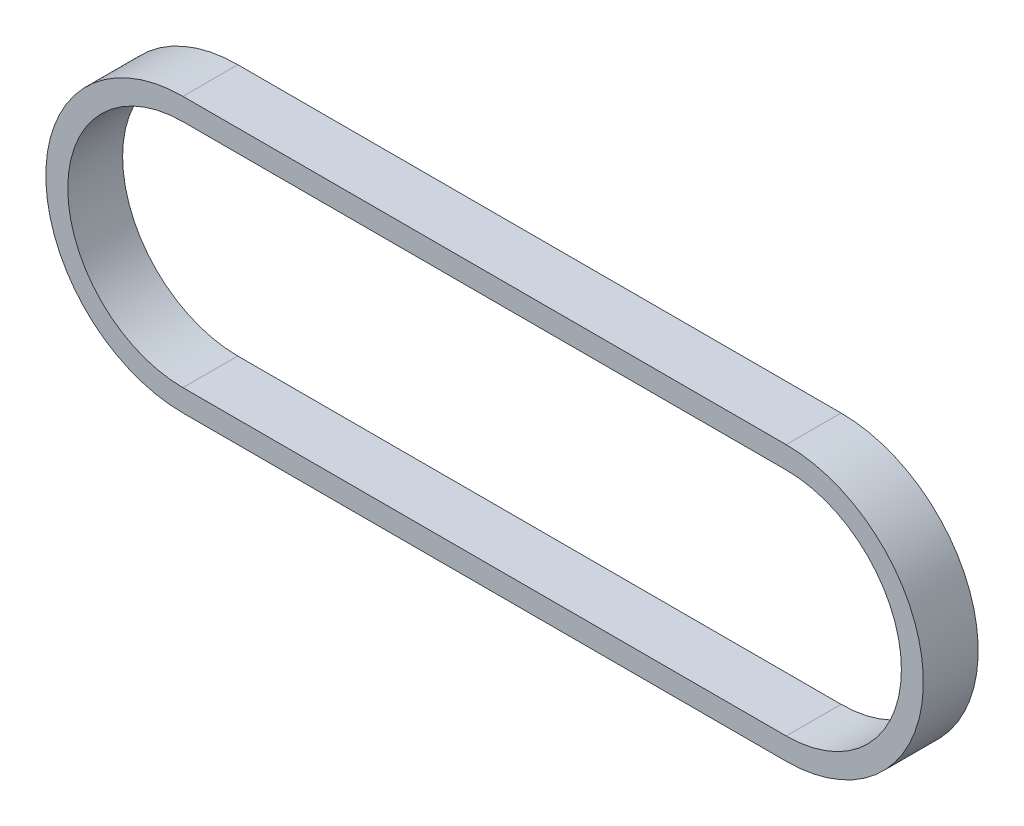
ISO-10303-21;
HEADER;
FILE_DESCRIPTION(('STEP AP214'),'2;1');
FILE_NAME('part.step','',(''),(''),'','','');
FILE_SCHEMA(('AUTOMOTIVE_DESIGN { 1 0 10303 214 1 1 1 1 }'));
ENDSEC;
DATA;
#1=APPLICATION_CONTEXT('core data for automotive mechanical design processes');
#2=APPLICATION_PROTOCOL_DEFINITION('international standard','automotive_design',2000,#1);
#3=PRODUCT_CONTEXT('',#1,'mechanical');
#4=PRODUCT('Part','Part','',(#3));
#5=PRODUCT_RELATED_PRODUCT_CATEGORY('part','',(#4));
#6=PRODUCT_DEFINITION_FORMATION('','',#4);
#7=PRODUCT_DEFINITION_CONTEXT('part definition',#1,'design');
#8=PRODUCT_DEFINITION('design','',#6,#7);
#9=PRODUCT_DEFINITION_SHAPE('','',#8);
#10=(LENGTH_UNIT() NAMED_UNIT(*) SI_UNIT(.MILLI.,.METRE.));
#11=(NAMED_UNIT(*) PLANE_ANGLE_UNIT() SI_UNIT($,.RADIAN.));
#12=(NAMED_UNIT(*) SI_UNIT($,.STERADIAN.) SOLID_ANGLE_UNIT());
#13=UNCERTAINTY_MEASURE_WITH_UNIT(LENGTH_MEASURE(1.E-05),#10,'distance_accuracy_value','');
#14=(GEOMETRIC_REPRESENTATION_CONTEXT(3) GLOBAL_UNCERTAINTY_ASSIGNED_CONTEXT((#13)) GLOBAL_UNIT_ASSIGNED_CONTEXT((#10,
#11,#12)) REPRESENTATION_CONTEXT('',''));
#15=CARTESIAN_POINT('',(0.,0.,0.));
#16=DIRECTION('',(0.,0.,1.));
#17=DIRECTION('',(1.,0.,0.));
#18=AXIS2_PLACEMENT_3D('',#15,#16,#17);
#19=CARTESIAN_POINT('',(0.,-3.05311331771918E-12,10.));
#20=DIRECTION('',(0.,0.,1.));
#21=DIRECTION('',(1.,0.,0.));
#22=AXIS2_PLACEMENT_3D('',#19,#20,#21);
#23=PLANE('',#22);
#24=CARTESIAN_POINT('',(0.,-3.05311331771918E-12,10.));
#25=DIRECTION('',(0.,0.,1.));
#26=DIRECTION('',(1.,0.,0.));
#27=AXIS2_PLACEMENT_3D('',#24,#25,#26);
#28=CIRCLE('',#27,25.);
#29=CARTESIAN_POINT('',(5.82796576721584E-13,-25.0000000000031,10.));
#30=VERTEX_POINT('',#29);
#31=CARTESIAN_POINT('',(-5.83112017288037E-13,24.9999999999969,10.));
#32=VERTEX_POINT('',#31);
#33=EDGE_CURVE('E138',#30,#32,#28,.T.);
#34=ORIENTED_EDGE('',*,*,#33,.T.);
#35=DIRECTION('',(-1.,0.,0.));
#36=VECTOR('',#35,1.);
#37=CARTESIAN_POINT('',(-109.999999999998,24.9999999999969,10.));
#38=LINE('',#37,#36);
#39=CARTESIAN_POINT('',(-109.999999999998,24.999999999997,10.));
#40=VERTEX_POINT('',#39);
#41=EDGE_CURVE('E141',#32,#40,#38,.T.);
#42=ORIENTED_EDGE('',*,*,#41,.T.);
#43=CARTESIAN_POINT('',(-109.999999999997,-3.05311331771918E-12,10.));
#44=DIRECTION('',(0.,0.,1.));
#45=DIRECTION('',(1.,0.,0.));
#46=AXIS2_PLACEMENT_3D('',#43,#44,#45);
#47=CIRCLE('',#46,25.);
#48=CARTESIAN_POINT('',(-109.999999999996,-25.0000000000031,10.));
#49=VERTEX_POINT('',#48);
#50=EDGE_CURVE('E144',#40,#49,#47,.T.);
#51=ORIENTED_EDGE('',*,*,#50,.T.);
#52=DIRECTION('',(1.,0.,0.));
#53=VECTOR('',#52,1.);
#54=CARTESIAN_POINT('',(5.82796576721584E-13,-25.0000000000031,10.));
#55=LINE('',#54,#53);
#56=EDGE_CURVE('E146',#49,#30,#55,.T.);
#57=ORIENTED_EDGE('',*,*,#56,.T.);
#58=EDGE_LOOP('',(#34,#42,#51,#57));
#59=FACE_BOUND('',#58,.T.);
#60=DIRECTION('',(-1.,0.,0.));
#61=VECTOR('',#60,1.);
#62=CARTESIAN_POINT('',(-109.999999999997,20.9999999999971,10.));
#63=LINE('',#62,#61);
#64=CARTESIAN_POINT('',(-1.20967921193697E-13,20.9999999999971,10.));
#65=VERTEX_POINT('',#64);
#66=CARTESIAN_POINT('',(-109.999999999997,20.9999999999971,10.));
#67=VERTEX_POINT('',#66);
#68=EDGE_CURVE('E110',#65,#67,#63,.T.);
#69=ORIENTED_EDGE('',*,*,#68,.F.);
#70=CARTESIAN_POINT('',(3.88578058618805E-13,-2.94209101525666E-12,10.));
#71=DIRECTION('',(0.,0.,1.));
#72=DIRECTION('',(1.,0.,0.));
#73=AXIS2_PLACEMENT_3D('',#70,#71,#72);
#74=CIRCLE('',#73,21.);
#75=CARTESIAN_POINT('',(8.9603286000609E-13,-21.0000000000029,10.));
#76=VERTEX_POINT('',#75);
#77=EDGE_CURVE('E102',#76,#65,#74,.T.);
#78=ORIENTED_EDGE('',*,*,#77,.F.);
#79=DIRECTION('',(1.,0.,0.));
#80=VECTOR('',#79,1.);
#81=CARTESIAN_POINT('',(8.9603286000609E-13,-21.0000000000029,10.));
#82=LINE('',#81,#80);
#83=CARTESIAN_POINT('',(-109.999999999996,-21.0000000000029,10.));
#84=VERTEX_POINT('',#83);
#85=EDGE_CURVE('E124',#84,#76,#82,.T.);
#86=ORIENTED_EDGE('',*,*,#85,.F.);
#87=CARTESIAN_POINT('',(-109.999999999997,-2.94209101525666E-12,10.));
#88=DIRECTION('',(0.,0.,1.));
#89=DIRECTION('',(1.,0.,0.));
#90=AXIS2_PLACEMENT_3D('',#87,#88,#89);
#91=CIRCLE('',#90,21.);
#92=EDGE_CURVE('E122',#67,#84,#91,.T.);
#93=ORIENTED_EDGE('',*,*,#92,.F.);
#94=EDGE_LOOP('',(#69,#78,#86,#93));
#95=FACE_BOUND('',#94,.T.);
#96=ADVANCED_FACE('F37',(#59,#95),#23,.T.);
#97=CARTESIAN_POINT('',(0.,-3.05311331771918E-12,0.));
#98=DIRECTION('',(0.,0.,1.));
#99=DIRECTION('',(1.,0.,0.));
#100=AXIS2_PLACEMENT_3D('',#97,#98,#99);
#101=PLANE('',#100);
#102=CARTESIAN_POINT('',(0.,-3.05311331771918E-12,0.));
#103=DIRECTION('',(0.,0.,1.));
#104=DIRECTION('',(1.,0.,0.));
#105=AXIS2_PLACEMENT_3D('',#102,#103,#104);
#106=CIRCLE('',#105,25.);
#107=CARTESIAN_POINT('',(5.82796576721584E-13,-25.0000000000031,0.));
#108=VERTEX_POINT('',#107);
#109=CARTESIAN_POINT('',(-5.83112017288037E-13,24.9999999999969,0.));
#110=VERTEX_POINT('',#109);
#111=EDGE_CURVE('E118',#108,#110,#106,.T.);
#112=ORIENTED_EDGE('',*,*,#111,.F.);
#113=DIRECTION('',(1.,0.,0.));
#114=VECTOR('',#113,1.);
#115=CARTESIAN_POINT('',(5.82796576721584E-13,-25.0000000000031,0.));
#116=LINE('',#115,#114);
#117=CARTESIAN_POINT('',(-109.999999999996,-25.0000000000031,0.));
#118=VERTEX_POINT('',#117);
#119=EDGE_CURVE('E142',#118,#108,#116,.T.);
#120=ORIENTED_EDGE('',*,*,#119,.F.);
#121=CARTESIAN_POINT('',(-109.999999999997,-3.05311331771918E-12,0.));
#122=DIRECTION('',(0.,0.,1.));
#123=DIRECTION('',(1.,0.,0.));
#124=AXIS2_PLACEMENT_3D('',#121,#122,#123);
#125=CIRCLE('',#124,25.);
#126=CARTESIAN_POINT('',(-109.999999999998,24.999999999997,0.));
#127=VERTEX_POINT('',#126);
#128=EDGE_CURVE('E153',#127,#118,#125,.T.);
#129=ORIENTED_EDGE('',*,*,#128,.F.);
#130=DIRECTION('',(-1.,0.,0.));
#131=VECTOR('',#130,1.);
#132=CARTESIAN_POINT('',(-109.999999999998,24.9999999999969,0.));
#133=LINE('',#132,#131);
#134=EDGE_CURVE('E151',#110,#127,#133,.T.);
#135=ORIENTED_EDGE('',*,*,#134,.F.);
#136=EDGE_LOOP('',(#112,#120,#129,#135));
#137=FACE_BOUND('',#136,.T.);
#138=CARTESIAN_POINT('',(3.88578058618805E-13,-2.94209101525666E-12,0.));
#139=DIRECTION('',(0.,0.,1.));
#140=DIRECTION('',(1.,0.,0.));
#141=AXIS2_PLACEMENT_3D('',#138,#139,#140);
#142=CIRCLE('',#141,21.);
#143=CARTESIAN_POINT('',(8.96032856958341E-13,-21.0000000000029,0.));
#144=VERTEX_POINT('',#143);
#145=CARTESIAN_POINT('',(-1.20967921193697E-13,20.9999999999971,0.));
#146=VERTEX_POINT('',#145);
#147=EDGE_CURVE('E60',#144,#146,#142,.T.);
#148=ORIENTED_EDGE('',*,*,#147,.T.);
#149=DIRECTION('',(-1.,0.,0.));
#150=VECTOR('',#149,1.);
#151=CARTESIAN_POINT('',(-109.999999999997,20.9999999999971,0.));
#152=LINE('',#151,#150);
#153=CARTESIAN_POINT('',(-109.999999999997,20.9999999999971,0.));
#154=VERTEX_POINT('',#153);
#155=EDGE_CURVE('E117',#146,#154,#152,.T.);
#156=ORIENTED_EDGE('',*,*,#155,.T.);
#157=CARTESIAN_POINT('',(-109.999999999997,-2.94209101525666E-12,0.));
#158=DIRECTION('',(0.,0.,1.));
#159=DIRECTION('',(1.,0.,0.));
#160=AXIS2_PLACEMENT_3D('',#157,#158,#159);
#161=CIRCLE('',#160,21.);
#162=CARTESIAN_POINT('',(-109.999999999996,-21.0000000000029,0.));
#163=VERTEX_POINT('',#162);
#164=EDGE_CURVE('E130',#154,#163,#161,.T.);
#165=ORIENTED_EDGE('',*,*,#164,.T.);
#166=DIRECTION('',(1.,0.,0.));
#167=VECTOR('',#166,1.);
#168=CARTESIAN_POINT('',(8.9603286000609E-13,-21.0000000000029,0.));
#169=LINE('',#168,#167);
#170=EDGE_CURVE('E111',#163,#144,#169,.T.);
#171=ORIENTED_EDGE('',*,*,#170,.T.);
#172=EDGE_LOOP('',(#148,#156,#165,#171));
#173=FACE_BOUND('',#172,.T.);
#174=ADVANCED_FACE('F171',(#137,#173),#101,.F.);
#175=CARTESIAN_POINT('',(0.,-3.05311331771918E-12,10.));
#176=DIRECTION('',(0.,0.,-1.));
#177=DIRECTION('',(-1.,0.,0.));
#178=AXIS2_PLACEMENT_3D('',#175,#176,#177);
#179=CYLINDRICAL_SURFACE('',#178,25.);
#180=ORIENTED_EDGE('',*,*,#111,.T.);
#181=DIRECTION('',(0.,0.,-1.));
#182=VECTOR('',#181,1.);
#183=CARTESIAN_POINT('',(-5.83112017288037E-13,24.9999999999969,10.));
#184=LINE('',#183,#182);
#185=EDGE_CURVE('E11',#32,#110,#184,.T.);
#186=ORIENTED_EDGE('',*,*,#185,.F.);
#187=ORIENTED_EDGE('',*,*,#33,.F.);
#188=DIRECTION('',(0.,0.,-1.));
#189=VECTOR('',#188,1.);
#190=CARTESIAN_POINT('',(5.82796576721584E-13,-25.0000000000031,10.));
#191=LINE('',#190,#189);
#192=EDGE_CURVE('E148',#30,#108,#191,.T.);
#193=ORIENTED_EDGE('',*,*,#192,.T.);
#194=EDGE_LOOP('',(#180,#186,#187,#193));
#195=FACE_BOUND('',#194,.T.);
#196=ADVANCED_FACE('F39',(#195),#179,.T.);
#197=CARTESIAN_POINT('',(-109.999999999998,24.9999999999969,10.));
#198=DIRECTION('',(0.,-1.,0.));
#199=DIRECTION('',(0.,0.,-1.));
#200=AXIS2_PLACEMENT_3D('',#197,#198,#199);
#201=PLANE('',#200);
#202=ORIENTED_EDGE('',*,*,#134,.T.);
#203=DIRECTION('',(0.,0.,-1.));
#204=VECTOR('',#203,1.);
#205=CARTESIAN_POINT('',(-109.999999999998,24.999999999997,10.));
#206=LINE('',#205,#204);
#207=EDGE_CURVE('E45',#40,#127,#206,.T.);
#208=ORIENTED_EDGE('',*,*,#207,.F.);
#209=ORIENTED_EDGE('',*,*,#41,.F.);
#210=ORIENTED_EDGE('',*,*,#185,.T.);
#211=EDGE_LOOP('',(#202,#208,#209,#210));
#212=FACE_BOUND('',#211,.T.);
#213=ADVANCED_FACE('F181',(#212),#201,.F.);
#214=CARTESIAN_POINT('',(-109.999999999997,-3.05311331771918E-12,10.));
#215=DIRECTION('',(0.,0.,-1.));
#216=DIRECTION('',(-1.,0.,0.));
#217=AXIS2_PLACEMENT_3D('',#214,#215,#216);
#218=CYLINDRICAL_SURFACE('',#217,25.);
#219=ORIENTED_EDGE('',*,*,#128,.T.);
#220=DIRECTION('',(0.,0.,-1.));
#221=VECTOR('',#220,1.);
#222=CARTESIAN_POINT('',(-109.999999999996,-25.0000000000031,10.));
#223=LINE('',#222,#221);
#224=EDGE_CURVE('E158',#49,#118,#223,.T.);
#225=ORIENTED_EDGE('',*,*,#224,.F.);
#226=ORIENTED_EDGE('',*,*,#50,.F.);
#227=ORIENTED_EDGE('',*,*,#207,.T.);
#228=EDGE_LOOP('',(#219,#225,#226,#227));
#229=FACE_BOUND('',#228,.T.);
#230=ADVANCED_FACE('F165',(#229),#218,.T.);
#231=CARTESIAN_POINT('',(5.82796576721584E-13,-25.0000000000031,10.));
#232=DIRECTION('',(0.,1.,0.));
#233=DIRECTION('',(-1.,0.,0.));
#234=AXIS2_PLACEMENT_3D('',#231,#232,#233);
#235=PLANE('',#234);
#236=ORIENTED_EDGE('',*,*,#119,.T.);
#237=ORIENTED_EDGE('',*,*,#192,.F.);
#238=ORIENTED_EDGE('',*,*,#56,.F.);
#239=ORIENTED_EDGE('',*,*,#224,.T.);
#240=EDGE_LOOP('',(#236,#237,#238,#239));
#241=FACE_BOUND('',#240,.T.);
#242=ADVANCED_FACE('F175',(#241),#235,.F.);
#243=CARTESIAN_POINT('',(3.88578058618805E-13,-2.94209101525666E-12,10.));
#244=DIRECTION('',(0.,0.,-1.));
#245=DIRECTION('',(-1.,0.,0.));
#246=AXIS2_PLACEMENT_3D('',#243,#244,#245);
#247=CYLINDRICAL_SURFACE('',#246,21.);
#248=ORIENTED_EDGE('',*,*,#147,.F.);
#249=DIRECTION('',(0.,0.,-1.));
#250=VECTOR('',#249,1.);
#251=CARTESIAN_POINT('',(8.9603286000609E-13,-21.0000000000029,10.));
#252=LINE('',#251,#250);
#253=EDGE_CURVE('E106',#76,#144,#252,.T.);
#254=ORIENTED_EDGE('',*,*,#253,.F.);
#255=ORIENTED_EDGE('',*,*,#77,.T.);
#256=DIRECTION('',(0.,0.,-1.));
#257=VECTOR('',#256,1.);
#258=CARTESIAN_POINT('',(-1.20967921193697E-13,20.9999999999971,10.));
#259=LINE('',#258,#257);
#260=EDGE_CURVE('E105',#65,#146,#259,.T.);
#261=ORIENTED_EDGE('',*,*,#260,.T.);
#262=EDGE_LOOP('',(#248,#254,#255,#261));
#263=FACE_BOUND('',#262,.T.);
#264=ADVANCED_FACE('F104',(#263),#247,.F.);
#265=CARTESIAN_POINT('',(-109.999999999997,20.9999999999971,10.));
#266=DIRECTION('',(0.,-1.,0.));
#267=DIRECTION('',(0.,0.,-1.));
#268=AXIS2_PLACEMENT_3D('',#265,#266,#267);
#269=PLANE('',#268);
#270=ORIENTED_EDGE('',*,*,#155,.F.);
#271=ORIENTED_EDGE('',*,*,#260,.F.);
#272=ORIENTED_EDGE('',*,*,#68,.T.);
#273=DIRECTION('',(0.,0.,-1.));
#274=VECTOR('',#273,1.);
#275=CARTESIAN_POINT('',(-109.999999999997,20.9999999999971,10.));
#276=LINE('',#275,#274);
#277=EDGE_CURVE('E119',#67,#154,#276,.T.);
#278=ORIENTED_EDGE('',*,*,#277,.T.);
#279=EDGE_LOOP('',(#270,#271,#272,#278));
#280=FACE_BOUND('',#279,.T.);
#281=ADVANCED_FACE('F114',(#280),#269,.T.);
#282=CARTESIAN_POINT('',(-109.999999999997,-2.94209101525666E-12,10.));
#283=DIRECTION('',(0.,0.,-1.));
#284=DIRECTION('',(-1.,0.,0.));
#285=AXIS2_PLACEMENT_3D('',#282,#283,#284);
#286=CYLINDRICAL_SURFACE('',#285,21.);
#287=ORIENTED_EDGE('',*,*,#164,.F.);
#288=ORIENTED_EDGE('',*,*,#277,.F.);
#289=ORIENTED_EDGE('',*,*,#92,.T.);
#290=DIRECTION('',(0.,0.,-1.));
#291=VECTOR('',#290,1.);
#292=CARTESIAN_POINT('',(-109.999999999996,-21.0000000000029,10.));
#293=LINE('',#292,#291);
#294=EDGE_CURVE('E52',#84,#163,#293,.T.);
#295=ORIENTED_EDGE('',*,*,#294,.T.);
#296=EDGE_LOOP('',(#287,#288,#289,#295));
#297=FACE_BOUND('',#296,.T.);
#298=ADVANCED_FACE('F204',(#297),#286,.F.);
#299=CARTESIAN_POINT('',(8.9603286000609E-13,-21.0000000000029,10.));
#300=DIRECTION('',(0.,1.,0.));
#301=DIRECTION('',(0.,0.,1.));
#302=AXIS2_PLACEMENT_3D('',#299,#300,#301);
#303=PLANE('',#302);
#304=ORIENTED_EDGE('',*,*,#170,.F.);
#305=ORIENTED_EDGE('',*,*,#294,.F.);
#306=ORIENTED_EDGE('',*,*,#85,.T.);
#307=ORIENTED_EDGE('',*,*,#253,.T.);
#308=EDGE_LOOP('',(#304,#305,#306,#307));
#309=FACE_BOUND('',#308,.T.);
#310=ADVANCED_FACE('F208',(#309),#303,.T.);
#311=CLOSED_SHELL('',(#96,#174,#196,#213,#230,#242,#264,#281,#298,#310));
#312=MANIFOLD_SOLID_BREP('B2',#311);
#313=ADVANCED_BREP_SHAPE_REPRESENTATION('',(#18,#312),#14);
#314=SHAPE_DEFINITION_REPRESENTATION(#9,#313);
ENDSEC;
END-ISO-10303-21;
